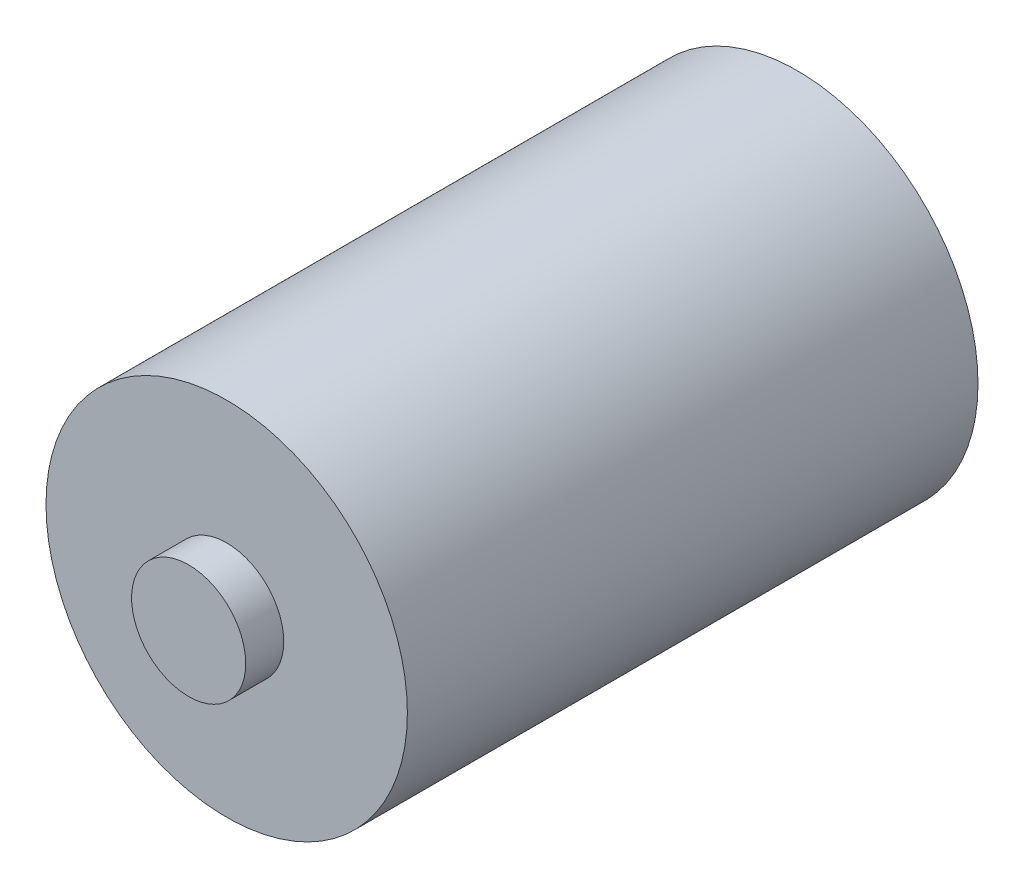
ISO-10303-21;
HEADER;
FILE_DESCRIPTION(('STEP AP214'),'2;1');
FILE_NAME('part.step','',(''),(''),'','','');
FILE_SCHEMA(('AUTOMOTIVE_DESIGN { 1 0 10303 214 1 1 1 1 }'));
ENDSEC;
DATA;
#1=APPLICATION_CONTEXT('core data for automotive mechanical design processes');
#2=APPLICATION_PROTOCOL_DEFINITION('international standard','automotive_design',2000,#1);
#3=PRODUCT_CONTEXT('',#1,'mechanical');
#4=PRODUCT('Part','Part','',(#3));
#5=PRODUCT_RELATED_PRODUCT_CATEGORY('part','',(#4));
#6=PRODUCT_DEFINITION_FORMATION('','',#4);
#7=PRODUCT_DEFINITION_CONTEXT('part definition',#1,'design');
#8=PRODUCT_DEFINITION('design','',#6,#7);
#9=PRODUCT_DEFINITION_SHAPE('','',#8);
#10=(LENGTH_UNIT() NAMED_UNIT(*) SI_UNIT(.MILLI.,.METRE.));
#11=(NAMED_UNIT(*) PLANE_ANGLE_UNIT() SI_UNIT($,.RADIAN.));
#12=(NAMED_UNIT(*) SI_UNIT($,.STERADIAN.) SOLID_ANGLE_UNIT());
#13=UNCERTAINTY_MEASURE_WITH_UNIT(LENGTH_MEASURE(1.E-05),#10,'distance_accuracy_value','');
#14=(GEOMETRIC_REPRESENTATION_CONTEXT(3) GLOBAL_UNCERTAINTY_ASSIGNED_CONTEXT((#13)) GLOBAL_UNIT_ASSIGNED_CONTEXT((#10,
#11,#12)) REPRESENTATION_CONTEXT('',''));
#15=CARTESIAN_POINT('',(0.,0.,0.));
#16=DIRECTION('',(0.,0.,1.));
#17=DIRECTION('',(1.,0.,0.));
#18=AXIS2_PLACEMENT_3D('',#15,#16,#17);
#19=CARTESIAN_POINT('',(0.,0.,75.));
#20=DIRECTION('',(0.,0.,-1.));
#21=DIRECTION('',(-1.,0.,0.));
#22=AXIS2_PLACEMENT_3D('',#19,#20,#21);
#23=CYLINDRICAL_SURFACE('',#22,47.5);
#24=CARTESIAN_POINT('',(0.,0.,75.));
#25=DIRECTION('',(0.,0.,1.));
#26=DIRECTION('',(1.,0.,0.));
#27=AXIS2_PLACEMENT_3D('',#24,#25,#26);
#28=CIRCLE('',#27,47.5);
#29=CARTESIAN_POINT('',(47.5,0.,75.));
#30=VERTEX_POINT('',#29);
#31=EDGE_CURVE('E51',#30,#30,#28,.T.);
#32=ORIENTED_EDGE('',*,*,#31,.F.);
#33=EDGE_LOOP('',(#32));
#34=FACE_BOUND('',#33,.T.);
#35=CARTESIAN_POINT('',(0.,0.,-75.));
#36=DIRECTION('',(0.,0.,1.));
#37=DIRECTION('',(1.,0.,0.));
#38=AXIS2_PLACEMENT_3D('',#35,#36,#37);
#39=CIRCLE('',#38,47.5);
#40=CARTESIAN_POINT('',(47.5,0.,-75.));
#41=VERTEX_POINT('',#40);
#42=EDGE_CURVE('E57',#41,#41,#39,.T.);
#43=ORIENTED_EDGE('',*,*,#42,.T.);
#44=EDGE_LOOP('',(#43));
#45=FACE_BOUND('',#44,.T.);
#46=ADVANCED_FACE('F43',(#34,#45),#23,.T.);
#47=CARTESIAN_POINT('',(0.,0.,75.));
#48=DIRECTION('',(0.,0.,1.));
#49=DIRECTION('',(1.,0.,0.));
#50=AXIS2_PLACEMENT_3D('',#47,#48,#49);
#51=PLANE('',#50);
#52=CARTESIAN_POINT('',(0.,0.,75.));
#53=DIRECTION('',(0.,0.,1.));
#54=DIRECTION('',(1.,0.,0.));
#55=AXIS2_PLACEMENT_3D('',#52,#53,#54);
#56=CIRCLE('',#55,15.);
#57=CARTESIAN_POINT('',(15.,0.,75.));
#58=VERTEX_POINT('',#57);
#59=EDGE_CURVE('E10',#58,#58,#56,.T.);
#60=ORIENTED_EDGE('',*,*,#59,.F.);
#61=EDGE_LOOP('',(#60));
#62=FACE_BOUND('',#61,.T.);
#63=ORIENTED_EDGE('',*,*,#31,.T.);
#64=EDGE_LOOP('',(#63));
#65=FACE_BOUND('',#64,.T.);
#66=ADVANCED_FACE('F94',(#62,#65),#51,.T.);
#67=CARTESIAN_POINT('',(0.,0.,-75.));
#68=DIRECTION('',(0.,0.,1.));
#69=DIRECTION('',(1.,0.,0.));
#70=AXIS2_PLACEMENT_3D('',#67,#68,#69);
#71=PLANE('',#70);
#72=CARTESIAN_POINT('',(0.,0.,-75.));
#73=DIRECTION('',(0.,0.,1.));
#74=DIRECTION('',(1.,0.,0.));
#75=AXIS2_PLACEMENT_3D('',#72,#73,#74);
#76=CIRCLE('',#75,15.);
#77=CARTESIAN_POINT('',(15.,0.,-75.));
#78=VERTEX_POINT('',#77);
#79=EDGE_CURVE('E46',#78,#78,#76,.T.);
#80=ORIENTED_EDGE('',*,*,#79,.T.);
#81=EDGE_LOOP('',(#80));
#82=FACE_BOUND('',#81,.T.);
#83=ORIENTED_EDGE('',*,*,#42,.F.);
#84=EDGE_LOOP('',(#83));
#85=FACE_BOUND('',#84,.T.);
#86=ADVANCED_FACE('F99',(#82,#85),#71,.F.);
#87=CARTESIAN_POINT('',(0.,0.,-85.));
#88=DIRECTION('',(0.,0.,1.));
#89=DIRECTION('',(1.,0.,0.));
#90=AXIS2_PLACEMENT_3D('',#87,#88,#89);
#91=PLANE('',#90);
#92=CARTESIAN_POINT('',(0.,0.,-85.));
#93=DIRECTION('',(0.,0.,1.));
#94=DIRECTION('',(1.,0.,0.));
#95=AXIS2_PLACEMENT_3D('',#92,#93,#94);
#96=CIRCLE('',#95,15.);
#97=CARTESIAN_POINT('',(15.,0.,-85.));
#98=VERTEX_POINT('',#97);
#99=EDGE_CURVE('E60',#98,#98,#96,.T.);
#100=ORIENTED_EDGE('',*,*,#99,.F.);
#101=EDGE_LOOP('',(#100));
#102=FACE_BOUND('',#101,.T.);
#103=ADVANCED_FACE('F90',(#102),#91,.F.);
#104=CARTESIAN_POINT('',(0.,0.,-85.));
#105=DIRECTION('',(0.,0.,1.));
#106=DIRECTION('',(1.,0.,0.));
#107=AXIS2_PLACEMENT_3D('',#104,#105,#106);
#108=CYLINDRICAL_SURFACE('',#107,15.);
#109=ORIENTED_EDGE('',*,*,#99,.T.);
#110=EDGE_LOOP('',(#109));
#111=FACE_BOUND('',#110,.T.);
#112=ORIENTED_EDGE('',*,*,#79,.F.);
#113=EDGE_LOOP('',(#112));
#114=FACE_BOUND('',#113,.T.);
#115=ADVANCED_FACE('F83',(#111,#114),#108,.T.);
#116=ORIENTED_EDGE('',*,*,#59,.T.);
#117=EDGE_LOOP('',(#116));
#118=FACE_BOUND('',#117,.T.);
#119=CARTESIAN_POINT('',(0.,0.,85.));
#120=DIRECTION('',(0.,0.,1.));
#121=DIRECTION('',(1.,0.,0.));
#122=AXIS2_PLACEMENT_3D('',#119,#120,#121);
#123=CIRCLE('',#122,15.);
#124=CARTESIAN_POINT('',(15.,0.,85.));
#125=VERTEX_POINT('',#124);
#126=EDGE_CURVE('E72',#125,#125,#123,.T.);
#127=ORIENTED_EDGE('',*,*,#126,.F.);
#128=EDGE_LOOP('',(#127));
#129=FACE_BOUND('',#128,.T.);
#130=ADVANCED_FACE('F81',(#118,#129),#108,.T.);
#131=CARTESIAN_POINT('',(0.,0.,85.));
#132=DIRECTION('',(0.,0.,1.));
#133=DIRECTION('',(1.,0.,0.));
#134=AXIS2_PLACEMENT_3D('',#131,#132,#133);
#135=PLANE('',#134);
#136=ORIENTED_EDGE('',*,*,#126,.T.);
#137=EDGE_LOOP('',(#136));
#138=FACE_BOUND('',#137,.T.);
#139=ADVANCED_FACE('F79',(#138),#135,.T.);
#140=CLOSED_SHELL('',(#46,#66,#86,#103,#115,#130,#139));
#141=MANIFOLD_SOLID_BREP('B2',#140);
#142=ADVANCED_BREP_SHAPE_REPRESENTATION('',(#18,#141),#14);
#143=SHAPE_DEFINITION_REPRESENTATION(#9,#142);
ENDSEC;
END-ISO-10303-21;
